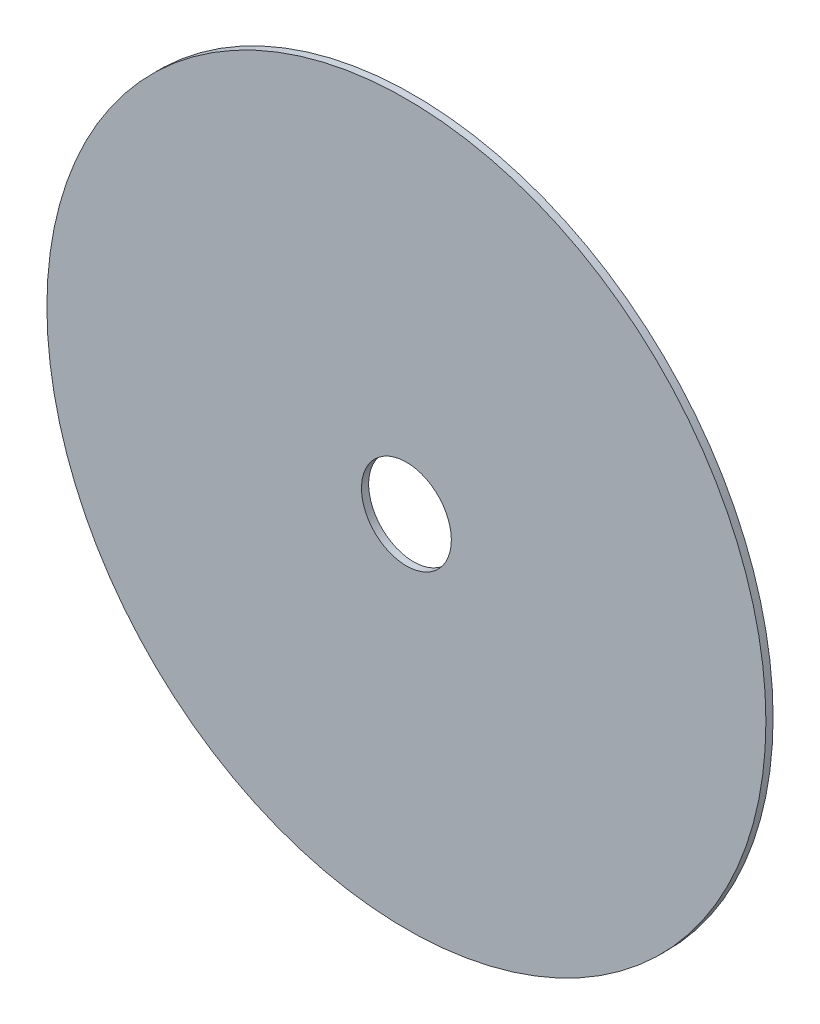
ISO-10303-21;
HEADER;
FILE_DESCRIPTION(('STEP AP214'),'2;1');
FILE_NAME('part.step','',(''),(''),'','','');
FILE_SCHEMA(('AUTOMOTIVE_DESIGN { 1 0 10303 214 1 1 1 1 }'));
ENDSEC;
DATA;
#1=APPLICATION_CONTEXT('core data for automotive mechanical design processes');
#2=APPLICATION_PROTOCOL_DEFINITION('international standard','automotive_design',2000,#1);
#3=PRODUCT_CONTEXT('',#1,'mechanical');
#4=PRODUCT('Part','Part','',(#3));
#5=PRODUCT_RELATED_PRODUCT_CATEGORY('part','',(#4));
#6=PRODUCT_DEFINITION_FORMATION('','',#4);
#7=PRODUCT_DEFINITION_CONTEXT('part definition',#1,'design');
#8=PRODUCT_DEFINITION('design','',#6,#7);
#9=PRODUCT_DEFINITION_SHAPE('','',#8);
#10=(LENGTH_UNIT() NAMED_UNIT(*) SI_UNIT(.MILLI.,.METRE.));
#11=(NAMED_UNIT(*) PLANE_ANGLE_UNIT() SI_UNIT($,.RADIAN.));
#12=(NAMED_UNIT(*) SI_UNIT($,.STERADIAN.) SOLID_ANGLE_UNIT());
#13=UNCERTAINTY_MEASURE_WITH_UNIT(LENGTH_MEASURE(1.E-05),#10,'distance_accuracy_value','');
#14=(GEOMETRIC_REPRESENTATION_CONTEXT(3) GLOBAL_UNCERTAINTY_ASSIGNED_CONTEXT((#13)) GLOBAL_UNIT_ASSIGNED_CONTEXT((#10,
#11,#12)) REPRESENTATION_CONTEXT('',''));
#15=CARTESIAN_POINT('',(0.,0.,0.));
#16=DIRECTION('',(0.,0.,1.));
#17=DIRECTION('',(1.,0.,0.));
#18=AXIS2_PLACEMENT_3D('',#15,#16,#17);
#19=CARTESIAN_POINT('',(0.,0.,1.2));
#20=DIRECTION('',(0.,0.,-1.));
#21=DIRECTION('',(-1.,0.,0.));
#22=AXIS2_PLACEMENT_3D('',#19,#20,#21);
#23=CYLINDRICAL_SURFACE('',#22,60.);
#24=CARTESIAN_POINT('',(0.,0.,1.2));
#25=DIRECTION('',(0.,0.,1.));
#26=DIRECTION('',(1.,0.,0.));
#27=AXIS2_PLACEMENT_3D('',#24,#25,#26);
#28=CIRCLE('',#27,60.);
#29=CARTESIAN_POINT('',(60.,0.,1.2));
#30=VERTEX_POINT('',#29);
#31=EDGE_CURVE('E40',#30,#30,#28,.T.);
#32=ORIENTED_EDGE('',*,*,#31,.F.);
#33=EDGE_LOOP('',(#32));
#34=FACE_BOUND('',#33,.T.);
#35=CARTESIAN_POINT('',(0.,0.,0.));
#36=DIRECTION('',(0.,0.,1.));
#37=DIRECTION('',(1.,0.,0.));
#38=AXIS2_PLACEMENT_3D('',#35,#36,#37);
#39=CIRCLE('',#38,60.);
#40=CARTESIAN_POINT('',(60.,0.,0.));
#41=VERTEX_POINT('',#40);
#42=EDGE_CURVE('E46',#41,#41,#39,.T.);
#43=ORIENTED_EDGE('',*,*,#42,.T.);
#44=EDGE_LOOP('',(#43));
#45=FACE_BOUND('',#44,.T.);
#46=ADVANCED_FACE('F33',(#34,#45),#23,.T.);
#47=CARTESIAN_POINT('',(0.,0.,1.2));
#48=DIRECTION('',(0.,0.,-1.));
#49=DIRECTION('',(-1.,0.,0.));
#50=AXIS2_PLACEMENT_3D('',#47,#48,#49);
#51=CYLINDRICAL_SURFACE('',#50,7.5);
#52=CARTESIAN_POINT('',(0.,0.,1.2));
#53=DIRECTION('',(0.,0.,1.));
#54=DIRECTION('',(1.,0.,0.));
#55=AXIS2_PLACEMENT_3D('',#52,#53,#54);
#56=CIRCLE('',#55,7.5);
#57=CARTESIAN_POINT('',(7.5,0.,1.2));
#58=VERTEX_POINT('',#57);
#59=EDGE_CURVE('E10',#58,#58,#56,.T.);
#60=ORIENTED_EDGE('',*,*,#59,.T.);
#61=EDGE_LOOP('',(#60));
#62=FACE_BOUND('',#61,.T.);
#63=CARTESIAN_POINT('',(0.,0.,0.));
#64=DIRECTION('',(0.,0.,1.));
#65=DIRECTION('',(1.,0.,0.));
#66=AXIS2_PLACEMENT_3D('',#63,#64,#65);
#67=CIRCLE('',#66,7.5);
#68=CARTESIAN_POINT('',(7.5,0.,0.));
#69=VERTEX_POINT('',#68);
#70=EDGE_CURVE('E36',#69,#69,#67,.T.);
#71=ORIENTED_EDGE('',*,*,#70,.F.);
#72=EDGE_LOOP('',(#71));
#73=FACE_BOUND('',#72,.T.);
#74=ADVANCED_FACE('F55',(#62,#73),#51,.F.);
#75=CARTESIAN_POINT('',(0.,0.,1.2));
#76=DIRECTION('',(0.,0.,1.));
#77=DIRECTION('',(1.,0.,0.));
#78=AXIS2_PLACEMENT_3D('',#75,#76,#77);
#79=PLANE('',#78);
#80=ORIENTED_EDGE('',*,*,#31,.T.);
#81=EDGE_LOOP('',(#80));
#82=FACE_BOUND('',#81,.T.);
#83=ORIENTED_EDGE('',*,*,#59,.F.);
#84=EDGE_LOOP('',(#83));
#85=FACE_BOUND('',#84,.T.);
#86=ADVANCED_FACE('F57',(#82,#85),#79,.T.);
#87=CARTESIAN_POINT('',(0.,0.,0.));
#88=DIRECTION('',(0.,0.,1.));
#89=DIRECTION('',(1.,0.,0.));
#90=AXIS2_PLACEMENT_3D('',#87,#88,#89);
#91=PLANE('',#90);
#92=ORIENTED_EDGE('',*,*,#42,.F.);
#93=EDGE_LOOP('',(#92));
#94=FACE_BOUND('',#93,.T.);
#95=ORIENTED_EDGE('',*,*,#70,.T.);
#96=EDGE_LOOP('',(#95));
#97=FACE_BOUND('',#96,.T.);
#98=ADVANCED_FACE('F53',(#94,#97),#91,.F.);
#99=CLOSED_SHELL('',(#46,#74,#86,#98));
#100=MANIFOLD_SOLID_BREP('B2',#99);
#101=ADVANCED_BREP_SHAPE_REPRESENTATION('',(#18,#100),#14);
#102=SHAPE_DEFINITION_REPRESENTATION(#9,#101);
ENDSEC;
END-ISO-10303-21;
